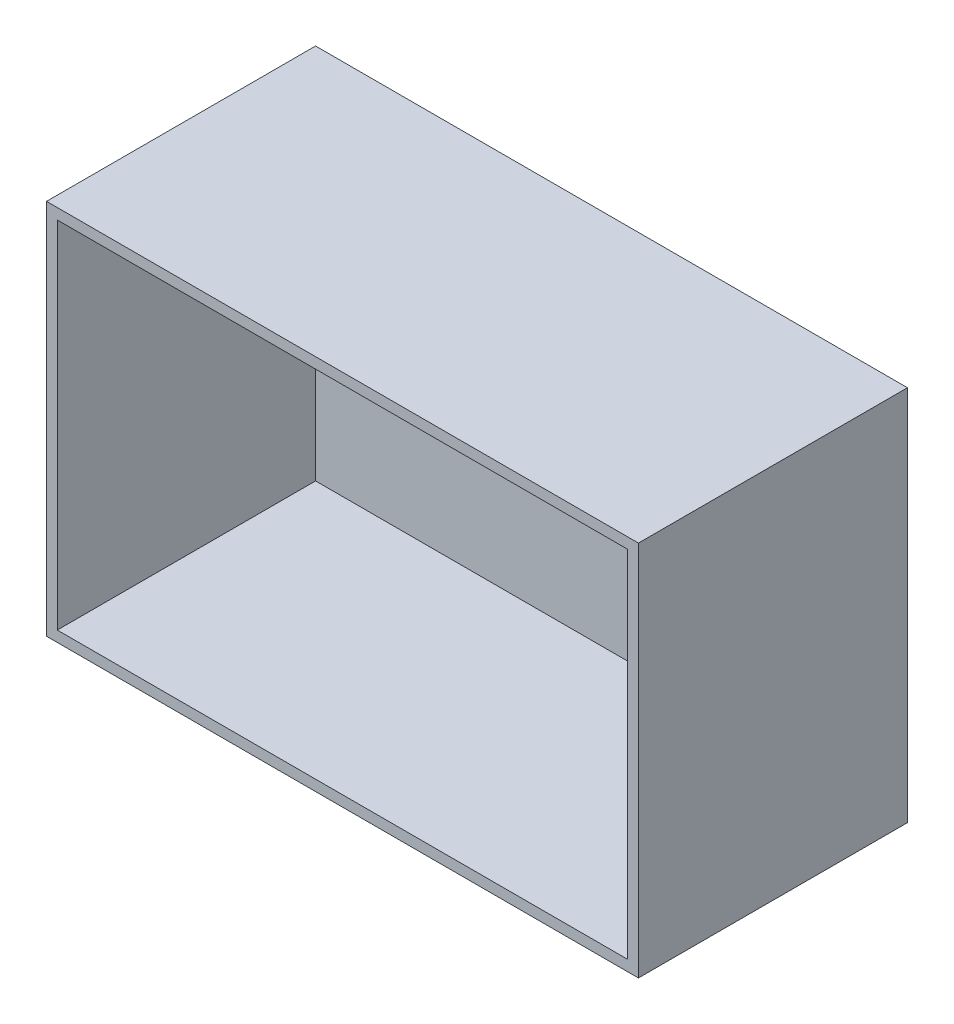
ISO-10303-21;
HEADER;
FILE_DESCRIPTION(('STEP AP214'),'2;1');
FILE_NAME('part.step','',(''),(''),'','','');
FILE_SCHEMA(('AUTOMOTIVE_DESIGN { 1 0 10303 214 1 1 1 1 }'));
ENDSEC;
DATA;
#1=APPLICATION_CONTEXT('core data for automotive mechanical design processes');
#2=APPLICATION_PROTOCOL_DEFINITION('international standard','automotive_design',2000,#1);
#3=PRODUCT_CONTEXT('',#1,'mechanical');
#4=PRODUCT('Part','Part','',(#3));
#5=PRODUCT_RELATED_PRODUCT_CATEGORY('part','',(#4));
#6=PRODUCT_DEFINITION_FORMATION('','',#4);
#7=PRODUCT_DEFINITION_CONTEXT('part definition',#1,'design');
#8=PRODUCT_DEFINITION('design','',#6,#7);
#9=PRODUCT_DEFINITION_SHAPE('','',#8);
#10=(LENGTH_UNIT() NAMED_UNIT(*) SI_UNIT(.MILLI.,.METRE.));
#11=(NAMED_UNIT(*) PLANE_ANGLE_UNIT() SI_UNIT($,.RADIAN.));
#12=(NAMED_UNIT(*) SI_UNIT($,.STERADIAN.) SOLID_ANGLE_UNIT());
#13=UNCERTAINTY_MEASURE_WITH_UNIT(LENGTH_MEASURE(1.E-05),#10,'distance_accuracy_value','');
#14=(GEOMETRIC_REPRESENTATION_CONTEXT(3) GLOBAL_UNCERTAINTY_ASSIGNED_CONTEXT((#13)) GLOBAL_UNIT_ASSIGNED_CONTEXT((#10,
#11,#12)) REPRESENTATION_CONTEXT('',''));
#15=CARTESIAN_POINT('',(0.,0.,0.));
#16=DIRECTION('',(0.,0.,1.));
#17=DIRECTION('',(1.,0.,0.));
#18=AXIS2_PLACEMENT_3D('',#15,#16,#17);
#19=CARTESIAN_POINT('',(-58.2886748148894,24.8785794750574,63.5));
#20=DIRECTION('',(1.,0.,0.));
#21=DIRECTION('',(0.,1.,0.));
#22=AXIS2_PLACEMENT_3D('',#19,#20,#21);
#23=PLANE('',#22);
#24=DIRECTION('',(0.,-1.,0.));
#25=VECTOR('',#24,1.);
#26=CARTESIAN_POINT('',(-58.2886748148894,24.8785794750574,0.));
#27=LINE('',#26,#25);
#28=CARTESIAN_POINT('',(-58.2886748148894,24.8785794750574,0.));
#29=VERTEX_POINT('',#28);
#30=CARTESIAN_POINT('',(-58.2886748148894,-64.0214205249425,0.));
#31=VERTEX_POINT('',#30);
#32=EDGE_CURVE('E188',#29,#31,#27,.T.);
#33=ORIENTED_EDGE('',*,*,#32,.T.);
#34=DIRECTION('',(0.,0.,-1.));
#35=VECTOR('',#34,1.);
#36=CARTESIAN_POINT('',(-58.2886748148894,-64.0214205249425,63.5));
#37=LINE('',#36,#35);
#38=CARTESIAN_POINT('',(-58.2886748148894,-64.0214205249425,63.5));
#39=VERTEX_POINT('',#38);
#40=EDGE_CURVE('E13',#39,#31,#37,.T.);
#41=ORIENTED_EDGE('',*,*,#40,.F.);
#42=DIRECTION('',(0.,-1.,0.));
#43=VECTOR('',#42,1.);
#44=CARTESIAN_POINT('',(-58.2886748148894,24.8785794750574,63.5));
#45=LINE('',#44,#43);
#46=CARTESIAN_POINT('',(-58.2886748148894,24.8785794750574,63.5));
#47=VERTEX_POINT('',#46);
#48=EDGE_CURVE('E177',#47,#39,#45,.T.);
#49=ORIENTED_EDGE('',*,*,#48,.F.);
#50=DIRECTION('',(0.,0.,-1.));
#51=VECTOR('',#50,1.);
#52=CARTESIAN_POINT('',(-58.2886748148894,24.8785794750574,63.5));
#53=LINE('',#52,#51);
#54=EDGE_CURVE('E187',#47,#29,#53,.T.);
#55=ORIENTED_EDGE('',*,*,#54,.T.);
#56=EDGE_LOOP('',(#33,#41,#49,#55));
#57=FACE_BOUND('',#56,.T.);
#58=ADVANCED_FACE('F55',(#57),#23,.F.);
#59=CARTESIAN_POINT('',(-58.2886748148894,-64.0214205249425,63.5));
#60=DIRECTION('',(0.,1.,0.));
#61=DIRECTION('',(0.,0.,1.));
#62=AXIS2_PLACEMENT_3D('',#59,#60,#61);
#63=PLANE('',#62);
#64=DIRECTION('',(1.,0.,0.));
#65=VECTOR('',#64,1.);
#66=CARTESIAN_POINT('',(-58.2886748148894,-64.0214205249425,0.));
#67=LINE('',#66,#65);
#68=CARTESIAN_POINT('',(81.4113251851106,-64.0214205249425,0.));
#69=VERTEX_POINT('',#68);
#70=EDGE_CURVE('E192',#31,#69,#67,.T.);
#71=ORIENTED_EDGE('',*,*,#70,.T.);
#72=DIRECTION('',(0.,0.,-1.));
#73=VECTOR('',#72,1.);
#74=CARTESIAN_POINT('',(81.4113251851106,-64.0214205249425,63.5));
#75=LINE('',#74,#73);
#76=CARTESIAN_POINT('',(81.4113251851106,-64.0214205249425,63.5));
#77=VERTEX_POINT('',#76);
#78=EDGE_CURVE('E64',#77,#69,#75,.T.);
#79=ORIENTED_EDGE('',*,*,#78,.F.);
#80=DIRECTION('',(1.,0.,0.));
#81=VECTOR('',#80,1.);
#82=CARTESIAN_POINT('',(-58.2886748148894,-64.0214205249425,63.5));
#83=LINE('',#82,#81);
#84=EDGE_CURVE('E111',#39,#77,#83,.T.);
#85=ORIENTED_EDGE('',*,*,#84,.F.);
#86=ORIENTED_EDGE('',*,*,#40,.T.);
#87=EDGE_LOOP('',(#71,#79,#85,#86));
#88=FACE_BOUND('',#87,.T.);
#89=ADVANCED_FACE('F228',(#88),#63,.F.);
#90=CARTESIAN_POINT('',(81.4113251851106,24.8785794750574,63.5));
#91=DIRECTION('',(-1.,0.,0.));
#92=DIRECTION('',(0.,0.,1.));
#93=AXIS2_PLACEMENT_3D('',#90,#91,#92);
#94=PLANE('',#93);
#95=DIRECTION('',(0.,1.,0.));
#96=VECTOR('',#95,1.);
#97=CARTESIAN_POINT('',(81.4113251851106,24.8785794750574,0.));
#98=LINE('',#97,#96);
#99=CARTESIAN_POINT('',(81.4113251851106,24.8785794750574,0.));
#100=VERTEX_POINT('',#99);
#101=EDGE_CURVE('E195',#69,#100,#98,.T.);
#102=ORIENTED_EDGE('',*,*,#101,.T.);
#103=DIRECTION('',(0.,0.,-1.));
#104=VECTOR('',#103,1.);
#105=CARTESIAN_POINT('',(81.4113251851106,24.8785794750574,63.5));
#106=LINE('',#105,#104);
#107=CARTESIAN_POINT('',(81.4113251851106,24.8785794750574,63.5));
#108=VERTEX_POINT('',#107);
#109=EDGE_CURVE('E202',#108,#100,#106,.T.);
#110=ORIENTED_EDGE('',*,*,#109,.F.);
#111=DIRECTION('',(0.,1.,0.));
#112=VECTOR('',#111,1.);
#113=CARTESIAN_POINT('',(81.4113251851106,24.8785794750574,63.5));
#114=LINE('',#113,#112);
#115=EDGE_CURVE('E182',#77,#108,#114,.T.);
#116=ORIENTED_EDGE('',*,*,#115,.F.);
#117=ORIENTED_EDGE('',*,*,#78,.T.);
#118=EDGE_LOOP('',(#102,#110,#116,#117));
#119=FACE_BOUND('',#118,.T.);
#120=ADVANCED_FACE('F210',(#119),#94,.F.);
#121=CARTESIAN_POINT('',(-58.2886748148894,24.8785794750574,63.5));
#122=DIRECTION('',(0.,-1.,0.));
#123=DIRECTION('',(0.,0.,-1.));
#124=AXIS2_PLACEMENT_3D('',#121,#122,#123);
#125=PLANE('',#124);
#126=DIRECTION('',(-1.,0.,0.));
#127=VECTOR('',#126,1.);
#128=CARTESIAN_POINT('',(-58.2886748148894,24.8785794750574,0.));
#129=LINE('',#128,#127);
#130=EDGE_CURVE('E104',#100,#29,#129,.T.);
#131=ORIENTED_EDGE('',*,*,#130,.T.);
#132=ORIENTED_EDGE('',*,*,#54,.F.);
#133=DIRECTION('',(-1.,0.,0.));
#134=VECTOR('',#133,1.);
#135=CARTESIAN_POINT('',(-58.2886748148894,24.8785794750574,63.5));
#136=LINE('',#135,#134);
#137=EDGE_CURVE('E83',#108,#47,#136,.T.);
#138=ORIENTED_EDGE('',*,*,#137,.F.);
#139=ORIENTED_EDGE('',*,*,#109,.T.);
#140=EDGE_LOOP('',(#131,#132,#138,#139));
#141=FACE_BOUND('',#140,.T.);
#142=ADVANCED_FACE('F218',(#141),#125,.F.);
#143=CARTESIAN_POINT('',(0.,0.,63.5));
#144=DIRECTION('',(0.,0.,1.));
#145=DIRECTION('',(1.,0.,0.));
#146=AXIS2_PLACEMENT_3D('',#143,#144,#145);
#147=PLANE('',#146);
#148=DIRECTION('',(0.,-1.,0.));
#149=VECTOR('',#148,1.);
#150=CARTESIAN_POINT('',(-55.7486748148894,24.8785794750574,63.5));
#151=LINE('',#150,#149);
#152=CARTESIAN_POINT('',(-55.7486748148894,22.3385794750575,63.5));
#153=VERTEX_POINT('',#152);
#154=CARTESIAN_POINT('',(-55.7486748148894,-61.4814205249425,63.5));
#155=VERTEX_POINT('',#154);
#156=EDGE_CURVE('E161',#153,#155,#151,.T.);
#157=ORIENTED_EDGE('',*,*,#156,.F.);
#158=DIRECTION('',(-1.,0.,0.));
#159=VECTOR('',#158,1.);
#160=CARTESIAN_POINT('',(-58.2886748148894,22.3385794750575,63.5));
#161=LINE('',#160,#159);
#162=CARTESIAN_POINT('',(78.8713251851106,22.3385794750575,63.5));
#163=VERTEX_POINT('',#162);
#164=EDGE_CURVE('E174',#163,#153,#161,.T.);
#165=ORIENTED_EDGE('',*,*,#164,.F.);
#166=DIRECTION('',(0.,1.,0.));
#167=VECTOR('',#166,1.);
#168=CARTESIAN_POINT('',(78.8713251851106,24.8785794750574,63.5));
#169=LINE('',#168,#167);
#170=CARTESIAN_POINT('',(78.8713251851106,-61.4814205249425,63.5));
#171=VERTEX_POINT('',#170);
#172=EDGE_CURVE('E171',#171,#163,#169,.T.);
#173=ORIENTED_EDGE('',*,*,#172,.F.);
#174=DIRECTION('',(1.,0.,0.));
#175=VECTOR('',#174,1.);
#176=CARTESIAN_POINT('',(-58.2886748148894,-61.4814205249425,63.5));
#177=LINE('',#176,#175);
#178=EDGE_CURVE('E150',#155,#171,#177,.T.);
#179=ORIENTED_EDGE('',*,*,#178,.F.);
#180=EDGE_LOOP('',(#157,#165,#173,#179));
#181=FACE_BOUND('',#180,.T.);
#182=ORIENTED_EDGE('',*,*,#48,.T.);
#183=ORIENTED_EDGE('',*,*,#84,.T.);
#184=ORIENTED_EDGE('',*,*,#115,.T.);
#185=ORIENTED_EDGE('',*,*,#137,.T.);
#186=EDGE_LOOP('',(#182,#183,#184,#185));
#187=FACE_BOUND('',#186,.T.);
#188=ADVANCED_FACE('F220',(#181,#187),#147,.T.);
#189=CARTESIAN_POINT('',(0.,0.,0.));
#190=DIRECTION('',(0.,0.,1.));
#191=DIRECTION('',(1.,0.,0.));
#192=AXIS2_PLACEMENT_3D('',#189,#190,#191);
#193=PLANE('',#192);
#194=CARTESIAN_POINT('',(40.7713251851106,-20.317338289696,0.));
#195=DIRECTION('',(0.,0.,-1.));
#196=DIRECTION('',(-1.,0.,0.));
#197=AXIS2_PLACEMENT_3D('',#194,#195,#196);
#198=CIRCLE('',#197,7.62);
#199=CARTESIAN_POINT('',(33.1513251851106,-20.317338289696,0.));
#200=VERTEX_POINT('',#199);
#201=EDGE_CURVE('E337',#200,#200,#198,.T.);
#202=ORIENTED_EDGE('',*,*,#201,.F.);
#203=EDGE_LOOP('',(#202));
#204=FACE_BOUND('',#203,.T.);
#205=ORIENTED_EDGE('',*,*,#32,.F.);
#206=ORIENTED_EDGE('',*,*,#130,.F.);
#207=ORIENTED_EDGE('',*,*,#101,.F.);
#208=ORIENTED_EDGE('',*,*,#70,.F.);
#209=EDGE_LOOP('',(#205,#206,#207,#208));
#210=FACE_BOUND('',#209,.T.);
#211=ADVANCED_FACE('F214',(#204,#210),#193,.F.);
#212=CARTESIAN_POINT('',(-55.7486748148894,24.8785794750574,63.5));
#213=DIRECTION('',(1.,0.,0.));
#214=DIRECTION('',(0.,1.,0.));
#215=AXIS2_PLACEMENT_3D('',#212,#213,#214);
#216=PLANE('',#215);
#217=DIRECTION('',(0.,-1.,0.));
#218=VECTOR('',#217,1.);
#219=CARTESIAN_POINT('',(-55.7486748148894,24.8785794750574,2.54));
#220=LINE('',#219,#218);
#221=CARTESIAN_POINT('',(-55.7486748148894,22.3385794750575,2.54));
#222=VERTEX_POINT('',#221);
#223=CARTESIAN_POINT('',(-55.7486748148894,-61.4814205249425,2.54));
#224=VERTEX_POINT('',#223);
#225=EDGE_CURVE('E140',#222,#224,#220,.T.);
#226=ORIENTED_EDGE('',*,*,#225,.F.);
#227=DIRECTION('',(0.,0.,-1.));
#228=VECTOR('',#227,1.);
#229=CARTESIAN_POINT('',(-55.7486748148894,22.3385794750575,63.5));
#230=LINE('',#229,#228);
#231=EDGE_CURVE('E165',#153,#222,#230,.T.);
#232=ORIENTED_EDGE('',*,*,#231,.F.);
#233=ORIENTED_EDGE('',*,*,#156,.T.);
#234=DIRECTION('',(0.,0.,-1.));
#235=VECTOR('',#234,1.);
#236=CARTESIAN_POINT('',(-55.7486748148894,-61.4814205249425,63.5));
#237=LINE('',#236,#235);
#238=EDGE_CURVE('E154',#155,#224,#237,.T.);
#239=ORIENTED_EDGE('',*,*,#238,.T.);
#240=EDGE_LOOP('',(#226,#232,#233,#239));
#241=FACE_BOUND('',#240,.T.);
#242=ADVANCED_FACE('F258',(#241),#216,.T.);
#243=CARTESIAN_POINT('',(-58.2886748148894,-61.4814205249425,63.5));
#244=DIRECTION('',(0.,1.,0.));
#245=DIRECTION('',(0.,0.,1.));
#246=AXIS2_PLACEMENT_3D('',#243,#244,#245);
#247=PLANE('',#246);
#248=DIRECTION('',(1.,0.,0.));
#249=VECTOR('',#248,1.);
#250=CARTESIAN_POINT('',(-58.2886748148894,-61.4814205249425,2.54));
#251=LINE('',#250,#249);
#252=CARTESIAN_POINT('',(78.8713251851106,-61.4814205249425,2.54));
#253=VERTEX_POINT('',#252);
#254=EDGE_CURVE('E134',#224,#253,#251,.T.);
#255=ORIENTED_EDGE('',*,*,#254,.F.);
#256=ORIENTED_EDGE('',*,*,#238,.F.);
#257=ORIENTED_EDGE('',*,*,#178,.T.);
#258=DIRECTION('',(0.,0.,-1.));
#259=VECTOR('',#258,1.);
#260=CARTESIAN_POINT('',(78.8713251851106,-61.4814205249425,63.5));
#261=LINE('',#260,#259);
#262=EDGE_CURVE('E147',#171,#253,#261,.T.);
#263=ORIENTED_EDGE('',*,*,#262,.T.);
#264=EDGE_LOOP('',(#255,#256,#257,#263));
#265=FACE_BOUND('',#264,.T.);
#266=ADVANCED_FACE('F148',(#265),#247,.T.);
#267=CARTESIAN_POINT('',(78.8713251851106,24.8785794750574,63.5));
#268=DIRECTION('',(-1.,0.,0.));
#269=DIRECTION('',(0.,0.,1.));
#270=AXIS2_PLACEMENT_3D('',#267,#268,#269);
#271=PLANE('',#270);
#272=DIRECTION('',(0.,1.,0.));
#273=VECTOR('',#272,1.);
#274=CARTESIAN_POINT('',(78.8713251851106,24.8785794750574,2.54));
#275=LINE('',#274,#273);
#276=CARTESIAN_POINT('',(78.8713251851106,22.3385794750575,2.54));
#277=VERTEX_POINT('',#276);
#278=EDGE_CURVE('E138',#253,#277,#275,.T.);
#279=ORIENTED_EDGE('',*,*,#278,.F.);
#280=ORIENTED_EDGE('',*,*,#262,.F.);
#281=ORIENTED_EDGE('',*,*,#172,.T.);
#282=DIRECTION('',(0.,0.,-1.));
#283=VECTOR('',#282,1.);
#284=CARTESIAN_POINT('',(78.8713251851106,22.3385794750575,63.5));
#285=LINE('',#284,#283);
#286=EDGE_CURVE('E74',#163,#277,#285,.T.);
#287=ORIENTED_EDGE('',*,*,#286,.T.);
#288=EDGE_LOOP('',(#279,#280,#281,#287));
#289=FACE_BOUND('',#288,.T.);
#290=ADVANCED_FACE('F156',(#289),#271,.T.);
#291=CARTESIAN_POINT('',(-58.2886748148894,22.3385794750575,63.5));
#292=DIRECTION('',(0.,-1.,0.));
#293=DIRECTION('',(0.,0.,-1.));
#294=AXIS2_PLACEMENT_3D('',#291,#292,#293);
#295=PLANE('',#294);
#296=DIRECTION('',(-1.,0.,0.));
#297=VECTOR('',#296,1.);
#298=CARTESIAN_POINT('',(-58.2886748148894,22.3385794750575,2.54));
#299=LINE('',#298,#297);
#300=EDGE_CURVE('E158',#277,#222,#299,.T.);
#301=ORIENTED_EDGE('',*,*,#300,.F.);
#302=ORIENTED_EDGE('',*,*,#286,.F.);
#303=ORIENTED_EDGE('',*,*,#164,.T.);
#304=ORIENTED_EDGE('',*,*,#231,.T.);
#305=EDGE_LOOP('',(#301,#302,#303,#304));
#306=FACE_BOUND('',#305,.T.);
#307=ADVANCED_FACE('F274',(#306),#295,.T.);
#308=CARTESIAN_POINT('',(0.,0.,2.54));
#309=DIRECTION('',(0.,0.,1.));
#310=DIRECTION('',(1.,0.,0.));
#311=AXIS2_PLACEMENT_3D('',#308,#309,#310);
#312=PLANE('',#311);
#313=CARTESIAN_POINT('',(40.7713251851106,-20.317338289696,2.54));
#314=DIRECTION('',(0.,0.,1.));
#315=DIRECTION('',(1.,0.,0.));
#316=AXIS2_PLACEMENT_3D('',#313,#314,#315);
#317=CIRCLE('',#316,7.62);
#318=CARTESIAN_POINT('',(33.1513251851106,-20.317338289696,2.53999999999999));
#319=VERTEX_POINT('',#318);
#320=EDGE_CURVE('E58',#319,#319,#317,.T.);
#321=ORIENTED_EDGE('',*,*,#320,.F.);
#322=EDGE_LOOP('',(#321));
#323=FACE_BOUND('',#322,.T.);
#324=ORIENTED_EDGE('',*,*,#225,.T.);
#325=ORIENTED_EDGE('',*,*,#254,.T.);
#326=ORIENTED_EDGE('',*,*,#278,.T.);
#327=ORIENTED_EDGE('',*,*,#300,.T.);
#328=EDGE_LOOP('',(#324,#325,#326,#327));
#329=FACE_BOUND('',#328,.T.);
#330=ADVANCED_FACE('F136',(#323,#329),#312,.T.);
#331=CARTESIAN_POINT('',(40.7713251851106,-20.317338289696,76.2));
#332=DIRECTION('',(0.,0.,-1.));
#333=DIRECTION('',(-1.,0.,0.));
#334=AXIS2_PLACEMENT_3D('',#331,#332,#333);
#335=CYLINDRICAL_SURFACE('',#334,7.62);
#336=CARTESIAN_POINT('',(33.1513251851106,-20.317338289696,2.53999999999999));
#337=CARTESIAN_POINT('',(33.1513251851106,-20.317338289696,2.51354166666666));
#338=CARTESIAN_POINT('',(33.1513251851106,-20.317338289696,2.48708333333333));
#339=CARTESIAN_POINT('',(33.1513251851106,-20.317338289696,2.43416666666666));
#340=CARTESIAN_POINT('',(33.1513251851106,-20.317338289696,2.40770833333332));
#341=CARTESIAN_POINT('',(33.1513251851106,-20.317338289696,2.35479166666665));
#342=CARTESIAN_POINT('',(33.1513251851106,-20.317338289696,2.32833333333332));
#343=CARTESIAN_POINT('',(33.1513251851106,-20.317338289696,2.27541666666665));
#344=CARTESIAN_POINT('',(33.1513251851106,-20.317338289696,2.24895833333332));
#345=CARTESIAN_POINT('',(33.1513251851106,-20.317338289696,2.19604166666666));
#346=CARTESIAN_POINT('',(33.1513251851106,-20.317338289696,2.16958333333333));
#347=CARTESIAN_POINT('',(33.1513251851106,-20.317338289696,2.11666666666666));
#348=CARTESIAN_POINT('',(33.1513251851106,-20.317338289696,2.09020833333332));
#349=CARTESIAN_POINT('',(33.1513251851106,-20.317338289696,2.03729166666665));
#350=CARTESIAN_POINT('',(33.1513251851106,-20.317338289696,2.01083333333332));
#351=CARTESIAN_POINT('',(33.1513251851106,-20.317338289696,1.95791666666665));
#352=CARTESIAN_POINT('',(33.1513251851106,-20.317338289696,1.93145833333332));
#353=CARTESIAN_POINT('',(33.1513251851106,-20.317338289696,1.87854166666666));
#354=CARTESIAN_POINT('',(33.1513251851106,-20.317338289696,1.85208333333333));
#355=CARTESIAN_POINT('',(33.1513251851106,-20.317338289696,1.79916666666666));
#356=CARTESIAN_POINT('',(33.1513251851106,-20.317338289696,1.77270833333333));
#357=CARTESIAN_POINT('',(33.1513251851106,-20.317338289696,1.71979166666666));
#358=CARTESIAN_POINT('',(33.1513251851106,-20.317338289696,1.69333333333332));
#359=CARTESIAN_POINT('',(33.1513251851106,-20.317338289696,1.64041666666665));
#360=CARTESIAN_POINT('',(33.1513251851106,-20.317338289696,1.61395833333332));
#361=CARTESIAN_POINT('',(33.1513251851106,-20.317338289696,1.56104166666666));
#362=CARTESIAN_POINT('',(33.1513251851106,-20.317338289696,1.53458333333333));
#363=CARTESIAN_POINT('',(33.1513251851106,-20.317338289696,1.48166666666666));
#364=CARTESIAN_POINT('',(33.1513251851106,-20.317338289696,1.45520833333333));
#365=CARTESIAN_POINT('',(33.1513251851106,-20.317338289696,1.40229166666666));
#366=CARTESIAN_POINT('',(33.1513251851106,-20.317338289696,1.37583333333332));
#367=CARTESIAN_POINT('',(33.1513251851106,-20.317338289696,1.32291666666666));
#368=CARTESIAN_POINT('',(33.1513251851106,-20.317338289696,1.29645833333332));
#369=CARTESIAN_POINT('',(33.1513251851106,-20.317338289696,1.24354166666666));
#370=CARTESIAN_POINT('',(33.1513251851106,-20.317338289696,1.21708333333333));
#371=CARTESIAN_POINT('',(33.1513251851106,-20.317338289696,1.16416666666667));
#372=CARTESIAN_POINT('',(33.1513251851106,-20.317338289696,1.13770833333333));
#373=CARTESIAN_POINT('',(33.1513251851106,-20.317338289696,1.08479166666666));
#374=CARTESIAN_POINT('',(33.1513251851106,-20.317338289696,1.05833333333332));
#375=CARTESIAN_POINT('',(33.1513251851106,-20.317338289696,1.00541666666666));
#376=CARTESIAN_POINT('',(33.1513251851106,-20.317338289696,0.978958333333326));
#377=CARTESIAN_POINT('',(33.1513251851106,-20.317338289696,0.926041666666664));
#378=CARTESIAN_POINT('',(33.1513251851106,-20.317338289696,0.899583333333333));
#379=CARTESIAN_POINT('',(33.1513251851106,-20.317338289696,0.846666666666667));
#380=CARTESIAN_POINT('',(33.1513251851106,-20.317338289696,0.820208333333331));
#381=CARTESIAN_POINT('',(33.1513251851106,-20.317338289696,0.76729166666666));
#382=CARTESIAN_POINT('',(33.1513251851106,-20.317338289696,0.740833333333325));
#383=CARTESIAN_POINT('',(33.1513251851106,-20.317338289696,0.687916666666658));
#384=CARTESIAN_POINT('',(33.1513251851106,-20.317338289696,0.661458333333328));
#385=CARTESIAN_POINT('',(33.1513251851106,-20.317338289696,0.608541666666666));
#386=CARTESIAN_POINT('',(33.1513251851106,-20.317338289696,0.582083333333335));
#387=CARTESIAN_POINT('',(33.1513251851106,-20.317338289696,0.529166666666669));
#388=CARTESIAN_POINT('',(33.1513251851106,-20.317338289696,0.502708333333333));
#389=CARTESIAN_POINT('',(33.1513251851106,-20.317338289696,0.449791666666662));
#390=CARTESIAN_POINT('',(33.1513251851106,-20.317338289696,0.423333333333327));
#391=CARTESIAN_POINT('',(33.1513251851106,-20.317338289696,0.37041666666666));
#392=CARTESIAN_POINT('',(33.1513251851106,-20.317338289696,0.343958333333329));
#393=CARTESIAN_POINT('',(33.1513251851106,-20.317338289696,0.291041666666667));
#394=CARTESIAN_POINT('',(33.1513251851106,-20.317338289696,0.264583333333337));
#395=CARTESIAN_POINT('',(33.1513251851106,-20.317338289696,0.21166666666667));
#396=CARTESIAN_POINT('',(33.1513251851106,-20.317338289696,0.185208333333335));
#397=CARTESIAN_POINT('',(33.1513251851106,-20.317338289696,0.132291666666664));
#398=CARTESIAN_POINT('',(33.1513251851106,-20.317338289696,0.105833333333328));
#399=CARTESIAN_POINT('',(33.1513251851106,-20.317338289696,0.0529166666666618));
#400=CARTESIAN_POINT('',(33.1513251851106,-20.317338289696,0.0264583333333309));
#401=CARTESIAN_POINT('',(33.1513251851106,-20.317338289696,0.));
#402=B_SPLINE_CURVE_WITH_KNOTS('',3,(#336,#337,#338,#339,#340,#341,#342,#343,#344,#345,#346,
#347,#348,#349,#350,#351,#352,#353,#354,#355,#356,#357,#358,#359,#360,#361,#362,#363,#364,#365,
#366,#367,#368,#369,#370,#371,#372,#373,#374,#375,#376,#377,#378,#379,#380,#381,#382,#383,#384,
#385,#386,#387,#388,#389,#390,#391,#392,#393,#394,#395,#396,#397,#398,#399,#400,#401),
.UNSPECIFIED.,.F.,.F.,(4,2,2,2,2,2,2,2,2,2,2,2,2,2,2,2,2,2,2,2,2,2,2,2,2,2,2,2,2,2,2,2,4),(0.,
0.0793749999999926,0.158749999999999,0.238125000000006,0.317499999999998,0.396874999999991,
0.476249999999998,0.555625000000004,0.634999999999997,0.714374999999989,0.793749999999996,
0.873125000000002,0.952499999999995,1.03187499999999,1.11124999999999,1.190625,1.26999999999999,
1.34937499999999,1.42874999999999,1.508125,1.58749999999999,1.66687499999998,1.74624999999999,
1.825625,1.90499999999999,1.98437499999998,2.06374999999999,2.143125,2.22249999999999,
2.30187499999998,2.38124999999999,2.46062499999999,2.53999999999999),.UNSPECIFIED.);
#403=EDGE_CURVE('BSEAM282',#319,#200,#402,.T.);
#404=ORIENTED_EDGE('',*,*,#320,.T.);
#405=ORIENTED_EDGE('',*,*,#201,.T.);
#406=ORIENTED_EDGE('',*,*,#403,.T.);
#407=ORIENTED_EDGE('',*,*,#403,.F.);
#408=EDGE_LOOP('',(#404,#406,#405,#407));
#409=FACE_BOUND('',#408,.T.);
#410=ADVANCED_FACE('F282',(#409),#335,.F.);
#411=CLOSED_SHELL('',(#58,#89,#120,#142,#188,#211,#242,#266,#290,#307,#330,#410));
#412=MANIFOLD_SOLID_BREP('B2',#411);
#413=ADVANCED_BREP_SHAPE_REPRESENTATION('',(#18,#412),#14);
#414=SHAPE_DEFINITION_REPRESENTATION(#9,#413);
ENDSEC;
END-ISO-10303-21;
